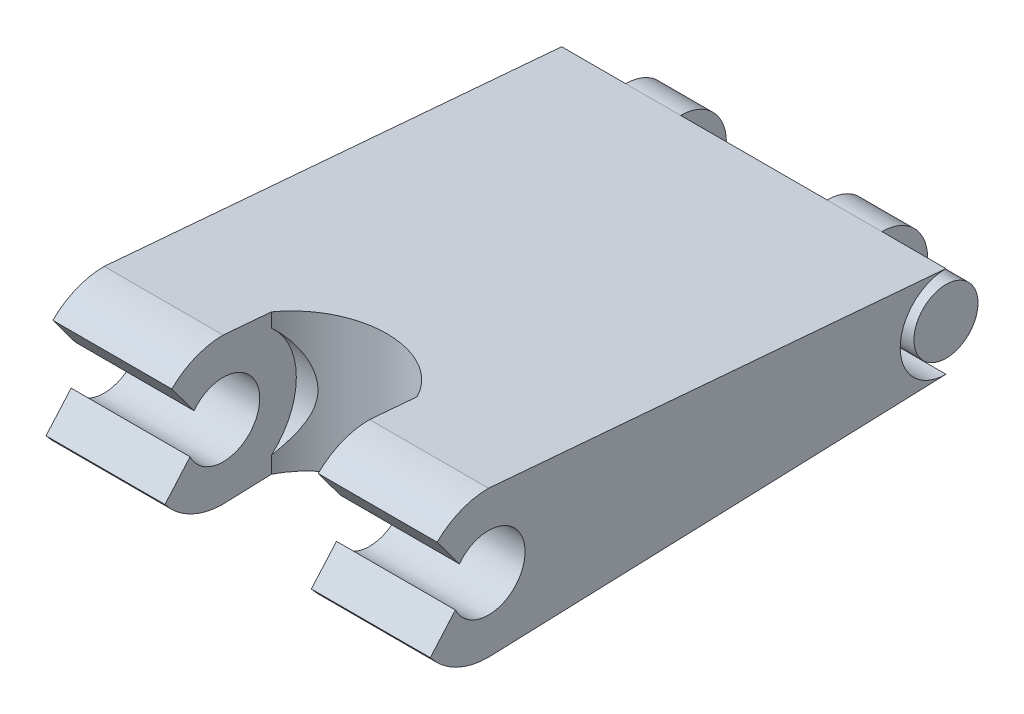
ISO-10303-21;
HEADER;
FILE_DESCRIPTION(('STEP AP214'),'2;1');
FILE_NAME('part.step','',(''),(''),'','','');
FILE_SCHEMA(('AUTOMOTIVE_DESIGN { 1 0 10303 214 1 1 1 1 }'));
ENDSEC;
DATA;
#1=APPLICATION_CONTEXT('core data for automotive mechanical design processes');
#2=APPLICATION_PROTOCOL_DEFINITION('international standard','automotive_design',2000,#1);
#3=PRODUCT_CONTEXT('',#1,'mechanical');
#4=PRODUCT('Part','Part','',(#3));
#5=PRODUCT_RELATED_PRODUCT_CATEGORY('part','',(#4));
#6=PRODUCT_DEFINITION_FORMATION('','',#4);
#7=PRODUCT_DEFINITION_CONTEXT('part definition',#1,'design');
#8=PRODUCT_DEFINITION('design','',#6,#7);
#9=PRODUCT_DEFINITION_SHAPE('','',#8);
#10=(LENGTH_UNIT() NAMED_UNIT(*) SI_UNIT(.MILLI.,.METRE.));
#11=(NAMED_UNIT(*) PLANE_ANGLE_UNIT() SI_UNIT($,.RADIAN.));
#12=(NAMED_UNIT(*) SI_UNIT($,.STERADIAN.) SOLID_ANGLE_UNIT());
#13=UNCERTAINTY_MEASURE_WITH_UNIT(LENGTH_MEASURE(1.E-05),#10,'distance_accuracy_value','');
#14=(GEOMETRIC_REPRESENTATION_CONTEXT(3) GLOBAL_UNCERTAINTY_ASSIGNED_CONTEXT((#13)) GLOBAL_UNIT_ASSIGNED_CONTEXT((#10,
#11,#12)) REPRESENTATION_CONTEXT('',''));
#15=CARTESIAN_POINT('',(0.,0.,0.));
#16=DIRECTION('',(0.,0.,1.));
#17=DIRECTION('',(1.,0.,0.));
#18=AXIS2_PLACEMENT_3D('',#15,#16,#17);
#19=CARTESIAN_POINT('',(-21.,0.,0.));
#20=DIRECTION('',(1.,0.,0.));
#21=DIRECTION('',(0.,0.,-1.));
#22=AXIS2_PLACEMENT_3D('',#19,#20,#21);
#23=PLANE('',#22);
#24=DIRECTION('',(0.,0.802569105901608,0.596559159054904));
#25=VECTOR('',#24,1.);
#26=CARTESIAN_POINT('',(-21.,5.70069365156147,5.61267243753337));
#27=LINE('',#26,#25);
#28=CARTESIAN_POINT('',(-21.,2.42718176620076,3.17943213071494));
#29=VERTEX_POINT('',#28);
#30=CARTESIAN_POINT('',(-21.,5.70069365156147,5.61267243753337));
#31=VERTEX_POINT('',#30);
#32=EDGE_CURVE('E319',#29,#31,#27,.T.);
#33=ORIENTED_EDGE('',*,*,#32,.T.);
#34=CARTESIAN_POINT('',(-21.,0.,0.));
#35=DIRECTION('',(1.,0.,0.));
#36=DIRECTION('',(0.,0.,-1.));
#37=AXIS2_PLACEMENT_3D('',#34,#35,#36);
#38=CIRCLE('',#37,8.);
#39=CARTESIAN_POINT('',(-21.,8.,0.));
#40=VERTEX_POINT('',#39);
#41=EDGE_CURVE('E238',#40,#31,#38,.T.);
#42=ORIENTED_EDGE('',*,*,#41,.F.);
#43=DIRECTION('',(0.,-0.0838982484988429,-0.996474326763528));
#44=VECTOR('',#43,1.);
#45=CARTESIAN_POINT('',(-21.,7.94368867119061,-0.668819605516189));
#46=LINE('',#45,#44);
#47=CARTESIAN_POINT('',(-21.,3.7902453557766,-50.));
#48=VERTEX_POINT('',#47);
#49=EDGE_CURVE('E233',#40,#48,#46,.T.);
#50=ORIENTED_EDGE('',*,*,#49,.T.);
#51=CARTESIAN_POINT('',(-21.,-1.2097546442234,-50.));
#52=DIRECTION('',(1.,0.,0.));
#53=DIRECTION('',(0.,0.,-1.));
#54=AXIS2_PLACEMENT_3D('',#51,#52,#53);
#55=CIRCLE('',#54,5.);
#56=CARTESIAN_POINT('',(-21.,-6.2097546442234,-50.));
#57=VERTEX_POINT('',#56);
#58=EDGE_CURVE('E438',#48,#57,#55,.T.);
#59=ORIENTED_EDGE('',*,*,#58,.T.);
#60=DIRECTION('',(0.,-0.0357819783679942,0.999359619968744));
#61=VECTOR('',#60,1.);
#62=CARTESIAN_POINT('',(-21.,-7.98975720019258,-0.286072514428548));
#63=LINE('',#62,#61);
#64=CARTESIAN_POINT('',(-21.,-8.,0.));
#65=VERTEX_POINT('',#64);
#66=EDGE_CURVE('E230',#57,#65,#63,.T.);
#67=ORIENTED_EDGE('',*,*,#66,.T.);
#68=CARTESIAN_POINT('',(-21.,-4.85376863620386,6.35931836175889));
#69=VERTEX_POINT('',#68);
#70=EDGE_CURVE('E237',#69,#65,#38,.T.);
#71=ORIENTED_EDGE('',*,*,#70,.F.);
#72=DIRECTION('',(0.,-0.752535857507383,0.65855127603371));
#73=VECTOR('',#72,1.);
#74=CARTESIAN_POINT('',(-21.,-4.85376863620386,6.35931836175889));
#75=LINE('',#74,#73);
#76=CARTESIAN_POINT('',(-21.,-1.71584498495738,3.61329157245808));
#77=VERTEX_POINT('',#76);
#78=EDGE_CURVE('E324',#77,#69,#75,.T.);
#79=ORIENTED_EDGE('',*,*,#78,.F.);
#80=CARTESIAN_POINT('',(-21.,0.,0.));
#81=DIRECTION('',(1.,0.,0.));
#82=DIRECTION('',(0.,0.,-1.));
#83=AXIS2_PLACEMENT_3D('',#80,#81,#82);
#84=CIRCLE('',#83,4.);
#85=EDGE_CURVE('E241',#77,#29,#84,.T.);
#86=ORIENTED_EDGE('',*,*,#85,.T.);
#87=EDGE_LOOP('',(#33,#42,#50,#59,#67,#71,#79,#86));
#88=FACE_BOUND('',#87,.T.);
#89=ADVANCED_FACE('F47',(#88),#23,.F.);
#90=CARTESIAN_POINT('',(21.,0.,0.));
#91=DIRECTION('',(-1.,0.,0.));
#92=DIRECTION('',(0.,0.,1.));
#93=AXIS2_PLACEMENT_3D('',#90,#91,#92);
#94=CYLINDRICAL_SURFACE('',#93,8.);
#95=DIRECTION('',(1.,0.,0.));
#96=VECTOR('',#95,1.);
#97=CARTESIAN_POINT('',(-32.6032128639547,5.70069365156147,5.61267243753337));
#98=LINE('',#97,#96);
#99=CARTESIAN_POINT('',(-8.,5.70069365156147,5.61267243753337));
#100=VERTEX_POINT('',#99);
#101=EDGE_CURVE('E316',#31,#100,#98,.T.);
#102=ORIENTED_EDGE('',*,*,#101,.T.);
#103=CARTESIAN_POINT('',(-8.,0.,0.));
#104=DIRECTION('',(1.,0.,0.));
#105=DIRECTION('',(0.,0.,-1.));
#106=AXIS2_PLACEMENT_3D('',#103,#104,#105);
#107=CIRCLE('',#106,8.);
#108=CARTESIAN_POINT('',(-8.,8.,0.));
#109=VERTEX_POINT('',#108);
#110=EDGE_CURVE('E478',#109,#100,#107,.T.);
#111=ORIENTED_EDGE('',*,*,#110,.F.);
#112=DIRECTION('',(-1.,0.,0.));
#113=VECTOR('',#112,1.);
#114=CARTESIAN_POINT('',(21.,8.,0.));
#115=LINE('',#114,#113);
#116=EDGE_CURVE('E245',#109,#40,#115,.T.);
#117=ORIENTED_EDGE('',*,*,#116,.T.);
#118=ORIENTED_EDGE('',*,*,#41,.T.);
#119=EDGE_LOOP('',(#102,#111,#117,#118));
#120=FACE_BOUND('',#119,.T.);
#121=ADVANCED_FACE('F419',(#120),#94,.T.);
#122=CARTESIAN_POINT('',(21.,0.,0.));
#123=DIRECTION('',(-1.,0.,0.));
#124=DIRECTION('',(0.,0.,1.));
#125=AXIS2_PLACEMENT_3D('',#122,#123,#124);
#126=CYLINDRICAL_SURFACE('',#125,4.);
#127=CARTESIAN_POINT('',(-8.,0.,0.));
#128=DIRECTION('',(1.,0.,0.));
#129=DIRECTION('',(0.,0.,-1.));
#130=AXIS2_PLACEMENT_3D('',#127,#128,#129);
#131=CIRCLE('',#130,4.);
#132=CARTESIAN_POINT('',(-8.,-1.71584498495738,3.61329157245808));
#133=VERTEX_POINT('',#132);
#134=CARTESIAN_POINT('',(-8.,2.42718176620076,3.17943213071494));
#135=VERTEX_POINT('',#134);
#136=EDGE_CURVE('E473',#133,#135,#131,.T.);
#137=ORIENTED_EDGE('',*,*,#136,.T.);
#138=DIRECTION('',(1.,0.,0.));
#139=VECTOR('',#138,1.);
#140=CARTESIAN_POINT('',(-32.6032128639547,2.42718176620076,3.17943213071494));
#141=LINE('',#140,#139);
#142=EDGE_CURVE('E70',#29,#135,#141,.T.);
#143=ORIENTED_EDGE('',*,*,#142,.F.);
#144=ORIENTED_EDGE('',*,*,#85,.F.);
#145=DIRECTION('',(1.,0.,0.));
#146=VECTOR('',#145,1.);
#147=CARTESIAN_POINT('',(-32.6032128639547,-1.71584498495738,3.61329157245808));
#148=LINE('',#147,#146);
#149=EDGE_CURVE('E321',#77,#133,#148,.T.);
#150=ORIENTED_EDGE('',*,*,#149,.T.);
#151=EDGE_LOOP('',(#137,#143,#144,#150));
#152=FACE_BOUND('',#151,.T.);
#153=ADVANCED_FACE('F425',(#152),#126,.F.);
#154=CARTESIAN_POINT('',(8.,5.70069365156147,5.61267243753337));
#155=VERTEX_POINT('',#154);
#156=CARTESIAN_POINT('',(21.,5.70069365156147,5.61267243753337));
#157=VERTEX_POINT('',#156);
#158=EDGE_CURVE('E311',#155,#157,#98,.T.);
#159=ORIENTED_EDGE('',*,*,#158,.T.);
#160=CARTESIAN_POINT('',(21.,0.,0.));
#161=DIRECTION('',(1.,0.,0.));
#162=DIRECTION('',(0.,0.,-1.));
#163=AXIS2_PLACEMENT_3D('',#160,#161,#162);
#164=CIRCLE('',#163,8.);
#165=CARTESIAN_POINT('',(21.,8.,0.));
#166=VERTEX_POINT('',#165);
#167=EDGE_CURVE('E220',#166,#157,#164,.T.);
#168=ORIENTED_EDGE('',*,*,#167,.F.);
#169=CARTESIAN_POINT('',(8.,8.,0.));
#170=VERTEX_POINT('',#169);
#171=EDGE_CURVE('E246',#166,#170,#115,.T.);
#172=ORIENTED_EDGE('',*,*,#171,.T.);
#173=CARTESIAN_POINT('',(8.,0.,0.));
#174=DIRECTION('',(1.,0.,0.));
#175=DIRECTION('',(0.,0.,-1.));
#176=AXIS2_PLACEMENT_3D('',#173,#174,#175);
#177=CIRCLE('',#176,8.);
#178=EDGE_CURVE('E288',#170,#155,#177,.T.);
#179=ORIENTED_EDGE('',*,*,#178,.T.);
#180=EDGE_LOOP('',(#159,#168,#172,#179));
#181=FACE_BOUND('',#180,.T.);
#182=ADVANCED_FACE('F310',(#181),#94,.T.);
#183=CARTESIAN_POINT('',(21.,0.,0.));
#184=DIRECTION('',(1.,0.,0.));
#185=DIRECTION('',(0.,0.,-1.));
#186=AXIS2_PLACEMENT_3D('',#183,#184,#185);
#187=CIRCLE('',#186,4.);
#188=CARTESIAN_POINT('',(21.,-1.71584498495738,3.61329157245808));
#189=VERTEX_POINT('',#188);
#190=CARTESIAN_POINT('',(21.,2.42718176620076,3.17943213071494));
#191=VERTEX_POINT('',#190);
#192=EDGE_CURVE('E214',#189,#191,#187,.T.);
#193=ORIENTED_EDGE('',*,*,#192,.T.);
#194=CARTESIAN_POINT('',(8.,2.42718176620076,3.17943213071494));
#195=VERTEX_POINT('',#194);
#196=EDGE_CURVE('E276',#195,#191,#141,.T.);
#197=ORIENTED_EDGE('',*,*,#196,.F.);
#198=CARTESIAN_POINT('',(8.,0.,0.));
#199=DIRECTION('',(1.,0.,0.));
#200=DIRECTION('',(0.,0.,-1.));
#201=AXIS2_PLACEMENT_3D('',#198,#199,#200);
#202=CIRCLE('',#201,4.);
#203=CARTESIAN_POINT('',(8.,-1.71584498495738,3.61329157245808));
#204=VERTEX_POINT('',#203);
#205=EDGE_CURVE('E269',#204,#195,#202,.T.);
#206=ORIENTED_EDGE('',*,*,#205,.F.);
#207=EDGE_CURVE('E275',#204,#189,#148,.T.);
#208=ORIENTED_EDGE('',*,*,#207,.T.);
#209=EDGE_LOOP('',(#193,#197,#206,#208));
#210=FACE_BOUND('',#209,.T.);
#211=ADVANCED_FACE('F274',(#210),#126,.F.);
#212=CARTESIAN_POINT('',(21.,0.,0.));
#213=DIRECTION('',(1.,0.,0.));
#214=DIRECTION('',(0.,0.,-1.));
#215=AXIS2_PLACEMENT_3D('',#212,#213,#214);
#216=PLANE('',#215);
#217=ORIENTED_EDGE('',*,*,#167,.T.);
#218=DIRECTION('',(0.,-0.802569105901608,-0.596559159054904));
#219=VECTOR('',#218,1.);
#220=CARTESIAN_POINT('',(21.,5.70069365156147,5.61267243753337));
#221=LINE('',#220,#219);
#222=EDGE_CURVE('E203',#157,#191,#221,.T.);
#223=ORIENTED_EDGE('',*,*,#222,.T.);
#224=ORIENTED_EDGE('',*,*,#192,.F.);
#225=DIRECTION('',(0.,0.752535857507383,-0.65855127603371));
#226=VECTOR('',#225,1.);
#227=CARTESIAN_POINT('',(21.,-4.85376863620386,6.35931836175889));
#228=LINE('',#227,#226);
#229=CARTESIAN_POINT('',(21.,-4.85376863620386,6.35931836175889));
#230=VERTEX_POINT('',#229);
#231=EDGE_CURVE('E197',#230,#189,#228,.T.);
#232=ORIENTED_EDGE('',*,*,#231,.F.);
#233=CARTESIAN_POINT('',(21.,-8.,0.));
#234=VERTEX_POINT('',#233);
#235=EDGE_CURVE('E210',#230,#234,#164,.T.);
#236=ORIENTED_EDGE('',*,*,#235,.T.);
#237=DIRECTION('',(0.,-0.0357819783679942,0.999359619968744));
#238=VECTOR('',#237,1.);
#239=CARTESIAN_POINT('',(21.,-7.98975720019258,-0.286072514428548));
#240=LINE('',#239,#238);
#241=CARTESIAN_POINT('',(21.,-6.2097546442234,-50.0000000000001));
#242=VERTEX_POINT('',#241);
#243=EDGE_CURVE('E224',#242,#234,#240,.T.);
#244=ORIENTED_EDGE('',*,*,#243,.F.);
#245=CARTESIAN_POINT('',(21.,-1.2097546442234,-50.));
#246=DIRECTION('',(1.,0.,0.));
#247=DIRECTION('',(0.,0.,-1.));
#248=AXIS2_PLACEMENT_3D('',#245,#246,#247);
#249=CIRCLE('',#248,5.);
#250=CARTESIAN_POINT('',(21.,3.7902453557766,-50.));
#251=VERTEX_POINT('',#250);
#252=EDGE_CURVE('E298',#251,#242,#249,.T.);
#253=ORIENTED_EDGE('',*,*,#252,.F.);
#254=DIRECTION('',(0.,-0.0838982484988429,-0.996474326763528));
#255=VECTOR('',#254,1.);
#256=CARTESIAN_POINT('',(21.,7.94368867119061,-0.668819605516189));
#257=LINE('',#256,#255);
#258=EDGE_CURVE('E221',#166,#251,#257,.T.);
#259=ORIENTED_EDGE('',*,*,#258,.F.);
#260=EDGE_LOOP('',(#217,#223,#224,#232,#236,#244,#253,#259));
#261=FACE_BOUND('',#260,.T.);
#262=ADVANCED_FACE('F208',(#261),#216,.T.);
#263=CARTESIAN_POINT('',(-8.,0.,0.));
#264=DIRECTION('',(1.,0.,0.));
#265=DIRECTION('',(0.,0.,-1.));
#266=AXIS2_PLACEMENT_3D('',#263,#264,#265);
#267=PLANE('',#266);
#268=ORIENTED_EDGE('',*,*,#110,.T.);
#269=DIRECTION('',(0.,-0.802569105901608,-0.596559159054904));
#270=VECTOR('',#269,1.);
#271=CARTESIAN_POINT('',(-8.,-0.658456042941642,0.885840858593788));
#272=LINE('',#271,#270);
#273=EDGE_CURVE('E328',#100,#135,#272,.T.);
#274=ORIENTED_EDGE('',*,*,#273,.T.);
#275=ORIENTED_EDGE('',*,*,#136,.F.);
#276=DIRECTION('',(0.,0.752535857507383,-0.65855127603371));
#277=VECTOR('',#276,1.);
#278=CARTESIAN_POINT('',(-8.,1.04654306105377,1.19589955790806));
#279=LINE('',#278,#277);
#280=CARTESIAN_POINT('',(-8.,-4.85376863620386,6.35931836175889));
#281=VERTEX_POINT('',#280);
#282=EDGE_CURVE('E326',#281,#133,#279,.T.);
#283=ORIENTED_EDGE('',*,*,#282,.F.);
#284=CARTESIAN_POINT('',(-8.,-8.,0.));
#285=VERTEX_POINT('',#284);
#286=EDGE_CURVE('E477',#281,#285,#107,.T.);
#287=ORIENTED_EDGE('',*,*,#286,.T.);
#288=DIRECTION('',(0.,-0.0357819783679942,0.999359619968744));
#289=VECTOR('',#288,1.);
#290=CARTESIAN_POINT('',(-8.,-7.98975720019258,-0.286072514428548));
#291=LINE('',#290,#289);
#292=CARTESIAN_POINT('',(-8.,-7.81122895886329,-5.27221144653723));
#293=VERTEX_POINT('',#292);
#294=EDGE_CURVE('E285',#293,#285,#291,.T.);
#295=ORIENTED_EDGE('',*,*,#294,.F.);
#296=DIRECTION('',(0.,1.,0.));
#297=VECTOR('',#296,1.);
#298=CARTESIAN_POINT('',(-8.,-10.,-5.27221144653723));
#299=LINE('',#298,#297);
#300=CARTESIAN_POINT('',(-8.,-6.01695824009123,-5.27221144653723));
#301=VERTEX_POINT('',#300);
#302=EDGE_CURVE('E335',#293,#301,#299,.T.);
#303=ORIENTED_EDGE('',*,*,#302,.T.);
#304=CARTESIAN_POINT('',(-8.,6.01695824009123,-5.27221144653723));
#305=VERTEX_POINT('',#304);
#306=EDGE_CURVE('E234',#301,#305,#107,.T.);
#307=ORIENTED_EDGE('',*,*,#306,.T.);
#308=CARTESIAN_POINT('',(-8.,7.55610566755224,-5.27221144653723));
#309=VERTEX_POINT('',#308);
#310=EDGE_CURVE('E330',#305,#309,#299,.T.);
#311=ORIENTED_EDGE('',*,*,#310,.T.);
#312=DIRECTION('',(0.,-0.0838982484988429,-0.996474326763528));
#313=VECTOR('',#312,1.);
#314=CARTESIAN_POINT('',(-8.,7.94368867119061,-0.668819605516189));
#315=LINE('',#314,#313);
#316=EDGE_CURVE('E476',#109,#309,#315,.T.);
#317=ORIENTED_EDGE('',*,*,#316,.F.);
#318=EDGE_LOOP('',(#268,#274,#275,#283,#287,#295,#303,#307,#311,#317));
#319=FACE_BOUND('',#318,.T.);
#320=ADVANCED_FACE('F407',(#319),#267,.T.);
#321=CARTESIAN_POINT('',(8.,0.,0.));
#322=DIRECTION('',(1.,0.,0.));
#323=DIRECTION('',(0.,0.,-1.));
#324=AXIS2_PLACEMENT_3D('',#321,#322,#323);
#325=PLANE('',#324);
#326=DIRECTION('',(0.,-0.802569105901608,-0.596559159054904));
#327=VECTOR('',#326,1.);
#328=CARTESIAN_POINT('',(8.,-0.658456042941642,0.885840858593788));
#329=LINE('',#328,#327);
#330=EDGE_CURVE('E11',#155,#195,#329,.T.);
#331=ORIENTED_EDGE('',*,*,#330,.F.);
#332=ORIENTED_EDGE('',*,*,#178,.F.);
#333=DIRECTION('',(0.,-0.0838982484988429,-0.996474326763528));
#334=VECTOR('',#333,1.);
#335=CARTESIAN_POINT('',(8.,7.94368867119061,-0.668819605516189));
#336=LINE('',#335,#334);
#337=CARTESIAN_POINT('',(8.,7.56150363340333,-5.20809885201226));
#338=VERTEX_POINT('',#337);
#339=EDGE_CURVE('E277',#170,#338,#336,.T.);
#340=ORIENTED_EDGE('',*,*,#339,.T.);
#341=DIRECTION('',(0.,1.,0.));
#342=VECTOR('',#341,1.);
#343=CARTESIAN_POINT('',(8.,-10.,-5.20809885201226));
#344=LINE('',#343,#342);
#345=CARTESIAN_POINT('',(8.,6.07253706021368,-5.20809885201226));
#346=VERTEX_POINT('',#345);
#347=EDGE_CURVE('E331',#346,#338,#344,.T.);
#348=ORIENTED_EDGE('',*,*,#347,.F.);
#349=CARTESIAN_POINT('',(8.,-6.07253706021368,-5.20809885201226));
#350=VERTEX_POINT('',#349);
#351=EDGE_CURVE('E292',#350,#346,#177,.T.);
#352=ORIENTED_EDGE('',*,*,#351,.F.);
#353=CARTESIAN_POINT('',(8.,-7.81352450435519,-5.20809885201226));
#354=VERTEX_POINT('',#353);
#355=EDGE_CURVE('E334',#354,#350,#344,.T.);
#356=ORIENTED_EDGE('',*,*,#355,.F.);
#357=DIRECTION('',(0.,-0.0357819783679942,0.999359619968744));
#358=VECTOR('',#357,1.);
#359=CARTESIAN_POINT('',(8.,-7.98975720019258,-0.286072514428548));
#360=LINE('',#359,#358);
#361=CARTESIAN_POINT('',(8.,-8.,0.));
#362=VERTEX_POINT('',#361);
#363=EDGE_CURVE('E291',#354,#362,#360,.T.);
#364=ORIENTED_EDGE('',*,*,#363,.T.);
#365=CARTESIAN_POINT('',(8.,-4.85376863620386,6.35931836175889));
#366=VERTEX_POINT('',#365);
#367=EDGE_CURVE('E271',#366,#362,#177,.T.);
#368=ORIENTED_EDGE('',*,*,#367,.F.);
#369=DIRECTION('',(0.,0.752535857507383,-0.65855127603371));
#370=VECTOR('',#369,1.);
#371=CARTESIAN_POINT('',(8.,1.04654306105377,1.19589955790806));
#372=LINE('',#371,#370);
#373=EDGE_CURVE('E55',#366,#204,#372,.T.);
#374=ORIENTED_EDGE('',*,*,#373,.T.);
#375=ORIENTED_EDGE('',*,*,#205,.T.);
#376=EDGE_LOOP('',(#331,#332,#340,#348,#352,#356,#364,#368,#374,#375));
#377=FACE_BOUND('',#376,.T.);
#378=ADVANCED_FACE('F268',(#377),#325,.F.);
#379=CARTESIAN_POINT('',(-8.,0.,0.));
#380=DIRECTION('',(1.,0.,0.));
#381=DIRECTION('',(0.,0.,-1.));
#382=AXIS2_PLACEMENT_3D('',#379,#380,#381);
#383=CYLINDRICAL_SURFACE('',#382,8.);
#384=ORIENTED_EDGE('',*,*,#306,.F.);
#385=CARTESIAN_POINT('',(-8.,-6.01695824009123,-5.27221144653723));
#386=CARTESIAN_POINT('',(-7.94823025137552,-5.93713889680411,-5.36330149977239));
#387=CARTESIAN_POINT('',(-7.89559362321301,-5.85551549790246,-5.45228635927292));
#388=CARTESIAN_POINT('',(-7.78892781803338,-5.68878236547478,-5.62603421921067));
#389=CARTESIAN_POINT('',(-7.73489880225821,-5.60367303496163,-5.71079770518938));
#390=CARTESIAN_POINT('',(-7.57121137553407,-5.3432621947039,-5.95877760265931));
#391=CARTESIAN_POINT('',(-7.45995761571154,-5.16288551480237,-6.11567471521768));
#392=CARTESIAN_POINT('',(-7.23495802940669,-4.78734423112402,-6.41400745377933));
#393=CARTESIAN_POINT('',(-7.12119825552961,-4.5920395394191,-6.55525533401989));
#394=CARTESIAN_POINT('',(-6.89574152907166,-4.18869608537276,-6.82004585449234));
#395=CARTESIAN_POINT('',(-6.78404404978122,-3.98066063470516,-6.94359307152216));
#396=CARTESIAN_POINT('',(-6.59555848325829,-3.60869152760248,-7.14207092545249));
#397=CARTESIAN_POINT('',(-6.51737373601737,-3.44770842075212,-7.22120164271144));
#398=CARTESIAN_POINT('',(-6.36620732476054,-3.11878938302571,-7.36924408818434));
#399=CARTESIAN_POINT('',(-6.29322674091125,-2.95085202010472,-7.4381536981111));
#400=CARTESIAN_POINT('',(-6.08593171119349,-2.43759597245042,-7.6282717607243));
#401=CARTESIAN_POINT('',(-5.96243998615266,-2.08129312089943,-7.73370260976427));
#402=CARTESIAN_POINT('',(-5.82814154731233,-1.57531287188291,-7.84463777316662));
#403=CARTESIAN_POINT('',(-5.7951759477782,-1.43584869912706,-7.87138908437504));
#404=CARTESIAN_POINT('',(-5.7376135669897,-1.15403731401675,-7.91760994896661));
#405=CARTESIAN_POINT('',(-5.71301240068372,-1.01169165388259,-7.93708331834156));
#406=CARTESIAN_POINT('',(-5.67321561809807,-0.725052948608439,-7.96837858060076));
#407=CARTESIAN_POINT('',(-5.65800698660538,-0.580762882607102,-7.98021106248723));
#408=CARTESIAN_POINT('',(-5.63764174464046,-0.291034278903472,-7.99602033635428));
#409=CARTESIAN_POINT('',(-5.63248509140908,-0.145595746089176,-7.99999716175128));
#410=CARTESIAN_POINT('',(-5.6324777652854,0.145582975283477,-8.00000284104297));
#411=CARTESIAN_POINT('',(-5.63764843537934,0.291323165442788,-7.99601523522773));
#412=CARTESIAN_POINT('',(-5.65808293099716,0.581648746690105,-7.98015201605002));
#413=CARTESIAN_POINT('',(-5.67334681495315,0.726234131087749,-7.96827635702165));
#414=CARTESIAN_POINT('',(-5.71329081562983,1.01345787665312,-7.93686343339263));
#415=CARTESIAN_POINT('',(-5.73798437467414,1.15609315581843,-7.91731523020636));
#416=CARTESIAN_POINT('',(-5.79576108313442,1.43846849324314,-7.87091614278629));
#417=CARTESIAN_POINT('',(-5.8288487286525,1.57820695636161,-7.84406134437998));
#418=CARTESIAN_POINT('',(-5.96740405655398,2.09934837015178,-7.72958060076222));
#419=CARTESIAN_POINT('',(-6.09712052810554,2.46956073678866,-7.61867917900986));
#420=CARTESIAN_POINT('',(-6.31487822187905,3.00188212510032,-7.41789040336493));
#421=CARTESIAN_POINT('',(-6.3915607000634,3.17591735996042,-7.34498358960105));
#422=CARTESIAN_POINT('',(-6.55027915641499,3.51645960307151,-7.18815408377895));
#423=CARTESIAN_POINT('',(-6.63231374168484,3.68296855110949,-7.10423425217707));
#424=CARTESIAN_POINT('',(-6.82196447001901,4.05199354099719,-6.90193758906819));
#425=CARTESIAN_POINT('',(-6.93055790862777,4.25223924174451,-6.78034603919861));
#426=CARTESIAN_POINT('',(-7.14936966613671,4.64075980368504,-6.52057753656378));
#427=CARTESIAN_POINT('',(-7.25958825759255,4.82903262810923,-6.3823977733745));
#428=CARTESIAN_POINT('',(-7.47738579616235,5.19127838688786,-6.09130949826248));
#429=CARTESIAN_POINT('',(-7.58498047351415,5.36538740607265,-5.93858247468503));
#430=CARTESIAN_POINT('',(-7.79615362741304,5.70088439540956,-5.61726576134988));
#431=CARTESIAN_POINT('',(-7.89973250938678,5.86227365143152,-5.44867767881245));
#432=CARTESIAN_POINT('',(-8.00000000000003,6.01695824009122,-5.27221144653724));
#433=B_SPLINE_CURVE_WITH_KNOTS('',3,(#385,#386,#387,#388,#389,#390,#391,#392,#393,#394,#395,
#396,#397,#398,#399,#400,#401,#402,#403,#404,#405,#406,#407,#408,#409,#410,#411,#412,#413,#414,
#415,#416,#417,#418,#419,#420,#421,#422,#423,#424,#425,#426,#427,#428,#429,#430,#431,#432),
.UNSPECIFIED.,.F.,.F.,(4,2,2,2,2,2,2,2,2,2,2,2,2,2,2,2,2,2,2,2,2,2,2,4),(0.,0.395070827970136,
0.790096109528034,1.5801845715534,2.37890903575441,3.17742660242258,3.76399666607666,
4.35068812488924,5.5183097425892,5.95532108522114,6.39210297025337,6.82827824161023,
7.26445165755846,7.70152742501366,8.13860572283069,8.57630943078743,9.01424808163703,
10.2293238916775,10.8400866283132,11.4506910418506,12.2244880247928,12.9984162922138,
13.7637116118872,14.5289294666133),.UNSPECIFIED.);
#434=EDGE_CURVE('E347',#301,#305,#433,.T.);
#435=ORIENTED_EDGE('',*,*,#434,.T.);
#436=EDGE_LOOP('',(#384,#435));
#437=FACE_BOUND('',#436,.T.);
#438=ADVANCED_FACE('F411',(#437),#383,.F.);
#439=CARTESIAN_POINT('',(21.,-1.2097546442234,-50.));
#440=DIRECTION('',(-1.,0.,0.));
#441=DIRECTION('',(0.,0.,1.));
#442=AXIS2_PLACEMENT_3D('',#439,#440,#441);
#443=CYLINDRICAL_SURFACE('',#442,5.);
#444=CARTESIAN_POINT('',(-14.,-1.2097546442234,-50.));
#445=DIRECTION('',(1.,0.,0.));
#446=DIRECTION('',(0.,0.,-1.));
#447=AXIS2_PLACEMENT_3D('',#444,#445,#446);
#448=CIRCLE('',#447,5.);
#449=CARTESIAN_POINT('',(-14.,-6.2097546442234,-50.0000000000001));
#450=VERTEX_POINT('',#449);
#451=CARTESIAN_POINT('',(-14.,3.7902453557766,-50.));
#452=VERTEX_POINT('',#451);
#453=EDGE_CURVE('E489',#450,#452,#448,.T.);
#454=ORIENTED_EDGE('',*,*,#453,.T.);
#455=DIRECTION('',(-1.,0.,0.));
#456=VECTOR('',#455,1.);
#457=CARTESIAN_POINT('',(21.,3.7902453557766,-50.));
#458=LINE('',#457,#456);
#459=CARTESIAN_POINT('',(-8.,3.7902453557766,-50.));
#460=VERTEX_POINT('',#459);
#461=EDGE_CURVE('E249',#460,#452,#458,.T.);
#462=ORIENTED_EDGE('',*,*,#461,.F.);
#463=CARTESIAN_POINT('',(-8.,-1.2097546442234,-50.));
#464=DIRECTION('',(1.,0.,0.));
#465=DIRECTION('',(0.,0.,-1.));
#466=AXIS2_PLACEMENT_3D('',#463,#464,#465);
#467=CIRCLE('',#466,5.);
#468=CARTESIAN_POINT('',(-8.,-6.2097546442234,-50.));
#469=VERTEX_POINT('',#468);
#470=EDGE_CURVE('E263',#469,#460,#467,.T.);
#471=ORIENTED_EDGE('',*,*,#470,.F.);
#472=DIRECTION('',(-1.,0.,0.));
#473=VECTOR('',#472,1.);
#474=CARTESIAN_POINT('',(21.,-6.2097546442234,-50.));
#475=LINE('',#474,#473);
#476=EDGE_CURVE('E253',#469,#450,#475,.T.);
#477=ORIENTED_EDGE('',*,*,#476,.T.);
#478=EDGE_LOOP('',(#454,#462,#471,#477));
#479=FACE_BOUND('',#478,.T.);
#480=ADVANCED_FACE('F416',(#479),#443,.T.);
#481=CARTESIAN_POINT('',(14.,-1.2097546442234,-50.));
#482=DIRECTION('',(1.,0.,0.));
#483=DIRECTION('',(0.,0.,-1.));
#484=AXIS2_PLACEMENT_3D('',#481,#482,#483);
#485=CIRCLE('',#484,5.);
#486=CARTESIAN_POINT('',(14.,-6.2097546442234,-50.));
#487=VERTEX_POINT('',#486);
#488=CARTESIAN_POINT('',(14.,3.7902453557766,-50.));
#489=VERTEX_POINT('',#488);
#490=EDGE_CURVE('E459',#487,#489,#485,.T.);
#491=ORIENTED_EDGE('',*,*,#490,.F.);
#492=CARTESIAN_POINT('',(8.,-6.2097546442234,-50.));
#493=VERTEX_POINT('',#492);
#494=EDGE_CURVE('E259',#487,#493,#475,.T.);
#495=ORIENTED_EDGE('',*,*,#494,.T.);
#496=CARTESIAN_POINT('',(8.,-1.2097546442234,-50.));
#497=DIRECTION('',(1.,0.,0.));
#498=DIRECTION('',(0.,0.,-1.));
#499=AXIS2_PLACEMENT_3D('',#496,#497,#498);
#500=CIRCLE('',#499,5.);
#501=CARTESIAN_POINT('',(8.,3.7902453557766,-50.));
#502=VERTEX_POINT('',#501);
#503=EDGE_CURVE('E258',#493,#502,#500,.T.);
#504=ORIENTED_EDGE('',*,*,#503,.T.);
#505=EDGE_CURVE('E254',#489,#502,#458,.T.);
#506=ORIENTED_EDGE('',*,*,#505,.F.);
#507=EDGE_LOOP('',(#491,#495,#504,#506));
#508=FACE_BOUND('',#507,.T.);
#509=ADVANCED_FACE('F507',(#508),#443,.T.);
#510=CARTESIAN_POINT('',(21.,-7.98975720019258,-0.286072514428548));
#511=DIRECTION('',(0.,-0.999359619968744,-0.0357819783679942));
#512=DIRECTION('',(0.,0.0357819783679942,-0.999359619968744));
#513=AXIS2_PLACEMENT_3D('',#510,#511,#512);
#514=PLANE('',#513);
#515=ORIENTED_EDGE('',*,*,#363,.F.);
#516=CARTESIAN_POINT('',(-0.0180492039932762,-7.97365551367114,-0.735778653016795));
#517=DIRECTION('',(0.,-0.999359619968744,-0.0357819783679942));
#518=DIRECTION('',(0.,0.0357819783679942,-0.999359619968744));
#519=AXIS2_PLACEMENT_3D('',#516,#517,#518);
#520=ELLIPSE('',#519,9.18688309648447,9.181);
#521=EDGE_CURVE('E439',#293,#354,#520,.T.);
#522=ORIENTED_EDGE('',*,*,#521,.F.);
#523=ORIENTED_EDGE('',*,*,#294,.T.);
#524=DIRECTION('',(-1.,0.,0.));
#525=VECTOR('',#524,1.);
#526=CARTESIAN_POINT('',(21.,-8.,0.));
#527=LINE('',#526,#525);
#528=EDGE_CURVE('E229',#285,#65,#527,.T.);
#529=ORIENTED_EDGE('',*,*,#528,.T.);
#530=ORIENTED_EDGE('',*,*,#66,.F.);
#531=DIRECTION('',(-1.,0.,0.));
#532=VECTOR('',#531,1.);
#533=CARTESIAN_POINT('',(-14.,-6.2097546442234,-50.0000000000001));
#534=LINE('',#533,#532);
#535=EDGE_CURVE('E454',#57,#450,#534,.F.);
#536=ORIENTED_EDGE('',*,*,#535,.T.);
#537=ORIENTED_EDGE('',*,*,#476,.F.);
#538=EDGE_CURVE('E260',#493,#469,#475,.T.);
#539=ORIENTED_EDGE('',*,*,#538,.F.);
#540=ORIENTED_EDGE('',*,*,#494,.F.);
#541=EDGE_CURVE('E256',#242,#487,#475,.T.);
#542=ORIENTED_EDGE('',*,*,#541,.F.);
#543=ORIENTED_EDGE('',*,*,#243,.T.);
#544=EDGE_CURVE('E218',#234,#362,#527,.T.);
#545=ORIENTED_EDGE('',*,*,#544,.T.);
#546=EDGE_LOOP('',(#515,#522,#523,#529,#530,#536,#537,#539,#540,#542,#543,#545));
#547=FACE_BOUND('',#546,.T.);
#548=ADVANCED_FACE('F49',(#547),#514,.T.);
#549=CARTESIAN_POINT('',(21.,7.94368867119061,-0.668819605516189));
#550=DIRECTION('',(0.,0.996474326763528,-0.0838982484988429));
#551=DIRECTION('',(0.,0.0838982484988429,0.996474326763528));
#552=AXIS2_PLACEMENT_3D('',#549,#550,#551);
#553=PLANE('',#552);
#554=CARTESIAN_POINT('',(-0.0180492039932762,7.93805104796684,-0.735778653016795));
#555=DIRECTION('',(0.,0.996474326763528,-0.0838982484988429));
#556=DIRECTION('',(0.,0.0838982484988429,0.996474326763528));
#557=AXIS2_PLACEMENT_3D('',#554,#555,#556);
#558=ELLIPSE('',#557,9.21348373301215,9.181);
#559=EDGE_CURVE('E445',#338,#309,#558,.T.);
#560=ORIENTED_EDGE('',*,*,#559,.F.);
#561=ORIENTED_EDGE('',*,*,#339,.F.);
#562=ORIENTED_EDGE('',*,*,#171,.F.);
#563=ORIENTED_EDGE('',*,*,#258,.T.);
#564=EDGE_CURVE('E250',#251,#489,#458,.T.);
#565=ORIENTED_EDGE('',*,*,#564,.T.);
#566=ORIENTED_EDGE('',*,*,#505,.T.);
#567=EDGE_CURVE('E255',#502,#460,#458,.T.);
#568=ORIENTED_EDGE('',*,*,#567,.T.);
#569=ORIENTED_EDGE('',*,*,#461,.T.);
#570=DIRECTION('',(-1.,0.,0.));
#571=VECTOR('',#570,1.);
#572=CARTESIAN_POINT('',(-14.,3.7902453557766,-50.));
#573=LINE('',#572,#571);
#574=EDGE_CURVE('E451',#452,#48,#573,.T.);
#575=ORIENTED_EDGE('',*,*,#574,.T.);
#576=ORIENTED_EDGE('',*,*,#49,.F.);
#577=ORIENTED_EDGE('',*,*,#116,.F.);
#578=ORIENTED_EDGE('',*,*,#316,.T.);
#579=EDGE_LOOP('',(#560,#561,#562,#563,#565,#566,#568,#569,#575,#576,#577,#578));
#580=FACE_BOUND('',#579,.T.);
#581=ADVANCED_FACE('F305',(#580),#553,.T.);
#582=ORIENTED_EDGE('',*,*,#286,.F.);
#583=DIRECTION('',(1.,0.,0.));
#584=VECTOR('',#583,1.);
#585=CARTESIAN_POINT('',(-32.6032128639547,-4.85376863620386,6.35931836175889));
#586=LINE('',#585,#584);
#587=EDGE_CURVE('E62',#69,#281,#586,.T.);
#588=ORIENTED_EDGE('',*,*,#587,.F.);
#589=ORIENTED_EDGE('',*,*,#70,.T.);
#590=ORIENTED_EDGE('',*,*,#528,.F.);
#591=EDGE_LOOP('',(#582,#588,#589,#590));
#592=FACE_BOUND('',#591,.T.);
#593=ADVANCED_FACE('F526',(#592),#94,.T.);
#594=ORIENTED_EDGE('',*,*,#235,.F.);
#595=EDGE_CURVE('E194',#366,#230,#586,.T.);
#596=ORIENTED_EDGE('',*,*,#595,.F.);
#597=ORIENTED_EDGE('',*,*,#367,.T.);
#598=ORIENTED_EDGE('',*,*,#544,.F.);
#599=EDGE_LOOP('',(#594,#596,#597,#598));
#600=FACE_BOUND('',#599,.T.);
#601=ADVANCED_FACE('F216',(#600),#94,.T.);
#602=ORIENTED_EDGE('',*,*,#351,.T.);
#603=CARTESIAN_POINT('',(8.,6.07253706021368,-5.20809885201225));
#604=CARTESIAN_POINT('',(7.94853465950026,5.99339983873956,-5.30036678004099));
#605=CARTESIAN_POINT('',(7.8961583397788,5.91243119421688,-5.39052361840139));
#606=CARTESIAN_POINT('',(7.78992657407529,5.74696031823185,-5.56660144054245));
#607=CARTESIAN_POINT('',(7.73607131176348,5.6624585248771,-5.65252294663889));
#608=CARTESIAN_POINT('',(7.57278717705242,5.40382581562604,-5.90393903154603));
#609=CARTESIAN_POINT('',(7.46163475489094,5.22455965094126,-6.06309438334717));
#610=CARTESIAN_POINT('',(7.23653784358646,4.85122207175219,-6.36584883119283));
#611=CARTESIAN_POINT('',(7.12257629106906,4.65701493664774,-6.50926698905252));
#612=CARTESIAN_POINT('',(6.89632518392295,4.2558064315683,-6.77838198486692));
#613=CARTESIAN_POINT('',(6.78403526414187,4.04880790819051,-6.90408274537037));
#614=CARTESIAN_POINT('',(6.59301911462895,3.67645324832976,-7.10749200666247));
#615=CARTESIAN_POINT('',(6.51304300741896,3.51395782161046,-7.18925993451246));
#616=CARTESIAN_POINT('',(6.35817827888271,3.18180493243304,-7.34231813454473));
#617=CARTESIAN_POINT('',(6.28329078266195,3.01214589944053,-7.41360609360557));
#618=CARTESIAN_POINT('',(6.07017736740224,2.49336478830602,-7.61046892573219));
#619=CARTESIAN_POINT('',(5.94267428868715,2.13291356546753,-7.71988717752235));
#620=CARTESIAN_POINT('',(5.80372720331041,1.62219409011824,-7.83508152180959));
#621=CARTESIAN_POINT('',(5.76978420407213,1.48264065780695,-7.8627146675684));
#622=CARTESIAN_POINT('',(5.71019704436505,1.20056226725205,-7.91069403497842));
#623=CARTESIAN_POINT('',(5.6845485098746,1.05803891752015,-7.9310440979129));
#624=CARTESIAN_POINT('',(5.64262354108391,0.770948741925158,-7.96407478120633));
#625=CARTESIAN_POINT('',(5.62633329276191,0.626385252455711,-7.97676670735137));
#626=CARTESIAN_POINT('',(5.60381442562818,0.33598861908405,-7.99426445946994));
#627=CARTESIAN_POINT('',(5.59758573847572,0.190155483812365,-7.99907033900753));
#628=CARTESIAN_POINT('',(5.59549448476404,-0.102004151310491,-8.00068683047169));
#629=CARTESIAN_POINT('',(5.59965850794195,-0.248330958159014,-7.99747693403331));
#630=CARTESIAN_POINT('',(5.61820113193545,-0.53993119580099,-7.98309385604645));
#631=CARTESIAN_POINT('',(5.632579769044,-0.685204622849888,-7.97192064620399));
#632=CARTESIAN_POINT('',(5.67090135065714,-0.973863052015426,-7.94183109565743));
#633=CARTESIAN_POINT('',(5.69485757513897,-1.11724514532026,-7.92290400276247));
#634=CARTESIAN_POINT('',(5.75132849628436,-1.40117662705247,-7.87765142400628));
#635=CARTESIAN_POINT('',(5.78384781754433,-1.54172444050496,-7.8513219398791));
#636=CARTESIAN_POINT('',(5.86972023685062,-1.8710126830467,-7.7805688210069));
#637=CARTESIAN_POINT('',(5.9263241698083,-2.0582450387767,-7.73305737585086));
#638=CARTESIAN_POINT('',(6.05027529160604,-2.42554356943756,-7.62583710791974));
#639=CARTESIAN_POINT('',(6.11762846014624,-2.60560568555511,-7.56612149085872));
#640=CARTESIAN_POINT('',(6.26049729063122,-2.95903921656603,-7.43503605586805));
#641=CARTESIAN_POINT('',(6.3360463813957,-3.13237899256897,-7.3636178525928));
#642=CARTESIAN_POINT('',(6.49256773937792,-3.47153174687748,-7.20993226219405));
#643=CARTESIAN_POINT('',(6.57353871981751,-3.63734649553628,-7.12766744483988));
#644=CARTESIAN_POINT('',(6.76695941656482,-4.01677877202659,-6.92289494023261));
#645=CARTESIAN_POINT('',(6.8807488554092,-4.22747334213397,-6.79621635588337));
#646=CARTESIAN_POINT('',(7.11019524621669,-4.63568899074487,-6.52460769763769));
#647=CARTESIAN_POINT('',(7.22585263047315,-4.83320696395103,-6.37967334452743));
#648=CARTESIAN_POINT('',(7.4542025540197,-5.21250033354757,-6.07359023953739));
#649=CARTESIAN_POINT('',(7.56691396586246,-5.39443359705198,-5.91265230267686));
#650=CARTESIAN_POINT('',(7.7324706035699,-5.6567971174812,-5.65822267556003));
#651=CARTESIAN_POINT('',(7.78707172587048,-5.74249656086819,-5.57124118492045));
#652=CARTESIAN_POINT('',(7.89476046979507,-5.91027004327429,-5.3929291196214));
#653=CARTESIAN_POINT('',(7.94784789660742,-5.99234361638628,-5.30159798916894));
#654=CARTESIAN_POINT('',(8.00000000000007,-6.07253706021366,-5.20809885201229));
#655=B_SPLINE_CURVE_WITH_KNOTS('',3,(#603,#604,#605,#606,#607,#608,#609,#610,#611,#612,#613,
#614,#615,#616,#617,#618,#619,#620,#621,#622,#623,#624,#625,#626,#627,#628,#629,#630,#631,#632,
#633,#634,#635,#636,#637,#638,#639,#640,#641,#642,#643,#644,#645,#646,#647,#648,#649,#650,#651,
#652,#653,#654),.UNSPECIFIED.,.F.,.F.,(4,2,2,2,2,2,2,2,2,2,2,2,2,2,2,2,2,2,2,2,2,2,2,2,2,4),(0.,
0.39593513249102,0.791821314106403,1.58355417352471,2.38360234866658,3.18347311773117,
3.77913384800772,4.37492585477914,5.56076682724532,5.99920247389455,6.43740653645102,
6.87496208084523,7.31251465323622,7.75118785036818,8.18986260613223,8.6291477356502,
9.06867059433564,9.67158797038275,10.2748419204127,10.8806561065677,11.4863270208541,
12.2979979917734,13.1098595764105,13.9121699612848,14.3133351197413,14.7145516769711),.UNSPECIFIED.);
#656=EDGE_CURVE('E338',#346,#350,#655,.T.);
#657=ORIENTED_EDGE('',*,*,#656,.T.);
#658=EDGE_LOOP('',(#602,#657));
#659=FACE_BOUND('',#658,.T.);
#660=ADVANCED_FACE('F353',(#659),#383,.F.);
#661=CARTESIAN_POINT('',(-8.,-1.2097546442234,-50.));
#662=DIRECTION('',(1.,0.,0.));
#663=DIRECTION('',(0.,0.,-1.));
#664=AXIS2_PLACEMENT_3D('',#661,#662,#663);
#665=CYLINDRICAL_SURFACE('',#664,3.5);
#666=CARTESIAN_POINT('',(-8.,-1.2097546442234,-50.));
#667=DIRECTION('',(1.,0.,0.));
#668=DIRECTION('',(0.,0.,-1.));
#669=AXIS2_PLACEMENT_3D('',#666,#667,#668);
#670=CIRCLE('',#669,3.5);
#671=CARTESIAN_POINT('',(-8.,-1.2097546442234,-53.5));
#672=VERTEX_POINT('',#671);
#673=EDGE_CURVE('E282',#672,#672,#670,.T.);
#674=ORIENTED_EDGE('',*,*,#673,.T.);
#675=EDGE_LOOP('',(#674));
#676=FACE_BOUND('',#675,.T.);
#677=CARTESIAN_POINT('',(8.,-1.2097546442234,-50.));
#678=DIRECTION('',(1.,0.,0.));
#679=DIRECTION('',(0.,0.,-1.));
#680=AXIS2_PLACEMENT_3D('',#677,#678,#679);
#681=CIRCLE('',#680,3.5);
#682=CARTESIAN_POINT('',(8.,-1.2097546442234,-53.5));
#683=VERTEX_POINT('',#682);
#684=EDGE_CURVE('E463',#683,#683,#681,.T.);
#685=ORIENTED_EDGE('',*,*,#684,.F.);
#686=EDGE_LOOP('',(#685));
#687=FACE_BOUND('',#686,.T.);
#688=ADVANCED_FACE('F402',(#676,#687),#665,.T.);
#689=CARTESIAN_POINT('',(-8.,-1.2097546442234,-50.));
#690=DIRECTION('',(1.,0.,0.));
#691=DIRECTION('',(0.,0.,-1.));
#692=AXIS2_PLACEMENT_3D('',#689,#690,#691);
#693=CYLINDRICAL_SURFACE('',#692,5.);
#694=ORIENTED_EDGE('',*,*,#538,.T.);
#695=CARTESIAN_POINT('',(-8.,-1.2097546442234,-50.));
#696=DIRECTION('',(1.,0.,0.));
#697=DIRECTION('',(0.,0.,-1.));
#698=AXIS2_PLACEMENT_3D('',#695,#696,#697);
#699=CIRCLE('',#698,5.);
#700=EDGE_CURVE('E278',#460,#469,#699,.T.);
#701=ORIENTED_EDGE('',*,*,#700,.F.);
#702=ORIENTED_EDGE('',*,*,#567,.F.);
#703=CARTESIAN_POINT('',(8.,-1.2097546442234,-50.));
#704=DIRECTION('',(1.,0.,0.));
#705=DIRECTION('',(0.,0.,-1.));
#706=AXIS2_PLACEMENT_3D('',#703,#704,#705);
#707=CIRCLE('',#706,5.);
#708=EDGE_CURVE('E467',#502,#493,#707,.T.);
#709=ORIENTED_EDGE('',*,*,#708,.T.);
#710=EDGE_LOOP('',(#694,#701,#702,#709));
#711=FACE_BOUND('',#710,.T.);
#712=ADVANCED_FACE('F395',(#711),#693,.F.);
#713=CARTESIAN_POINT('',(-8.,0.,0.));
#714=DIRECTION('',(1.,0.,0.));
#715=DIRECTION('',(0.,0.,-1.));
#716=AXIS2_PLACEMENT_3D('',#713,#714,#715);
#717=PLANE('',#716);
#718=ORIENTED_EDGE('',*,*,#673,.F.);
#719=EDGE_LOOP('',(#718));
#720=FACE_BOUND('',#719,.T.);
#721=ORIENTED_EDGE('',*,*,#700,.T.);
#722=ORIENTED_EDGE('',*,*,#470,.T.);
#723=EDGE_LOOP('',(#721,#722));
#724=FACE_BOUND('',#723,.T.);
#725=ADVANCED_FACE('F392',(#720,#724),#717,.T.);
#726=CARTESIAN_POINT('',(8.,0.,0.));
#727=DIRECTION('',(1.,0.,0.));
#728=DIRECTION('',(0.,0.,-1.));
#729=AXIS2_PLACEMENT_3D('',#726,#727,#728);
#730=PLANE('',#729);
#731=ORIENTED_EDGE('',*,*,#684,.T.);
#732=EDGE_LOOP('',(#731));
#733=FACE_BOUND('',#732,.T.);
#734=ORIENTED_EDGE('',*,*,#708,.F.);
#735=ORIENTED_EDGE('',*,*,#503,.F.);
#736=EDGE_LOOP('',(#734,#735));
#737=FACE_BOUND('',#736,.T.);
#738=ADVANCED_FACE('F390',(#733,#737),#730,.F.);
#739=CARTESIAN_POINT('',(14.,-1.2097546442234,-50.));
#740=DIRECTION('',(1.,0.,0.));
#741=DIRECTION('',(0.,0.,-1.));
#742=AXIS2_PLACEMENT_3D('',#739,#740,#741);
#743=CYLINDRICAL_SURFACE('',#742,3.5);
#744=CARTESIAN_POINT('',(14.,-1.2097546442234,-50.));
#745=DIRECTION('',(1.,0.,0.));
#746=DIRECTION('',(0.,0.,-1.));
#747=AXIS2_PLACEMENT_3D('',#744,#745,#746);
#748=CIRCLE('',#747,3.5);
#749=CARTESIAN_POINT('',(14.,-1.2097546442234,-53.5));
#750=VERTEX_POINT('',#749);
#751=EDGE_CURVE('E300',#750,#750,#748,.T.);
#752=ORIENTED_EDGE('',*,*,#751,.T.);
#753=EDGE_LOOP('',(#752));
#754=FACE_BOUND('',#753,.T.);
#755=CARTESIAN_POINT('',(21.,-1.2097546442234,-50.));
#756=DIRECTION('',(1.,0.,0.));
#757=DIRECTION('',(0.,0.,-1.));
#758=AXIS2_PLACEMENT_3D('',#755,#756,#757);
#759=CIRCLE('',#758,3.5);
#760=CARTESIAN_POINT('',(21.,-1.2097546442234,-53.5));
#761=VERTEX_POINT('',#760);
#762=EDGE_CURVE('E301',#761,#761,#759,.T.);
#763=ORIENTED_EDGE('',*,*,#762,.F.);
#764=EDGE_LOOP('',(#763));
#765=FACE_BOUND('',#764,.T.);
#766=ADVANCED_FACE('F387',(#754,#765),#743,.T.);
#767=CARTESIAN_POINT('',(14.,-1.2097546442234,-50.));
#768=DIRECTION('',(1.,0.,0.));
#769=DIRECTION('',(0.,0.,-1.));
#770=AXIS2_PLACEMENT_3D('',#767,#768,#769);
#771=CYLINDRICAL_SURFACE('',#770,5.);
#772=ORIENTED_EDGE('',*,*,#541,.T.);
#773=EDGE_CURVE('E460',#489,#487,#485,.T.);
#774=ORIENTED_EDGE('',*,*,#773,.F.);
#775=ORIENTED_EDGE('',*,*,#564,.F.);
#776=ORIENTED_EDGE('',*,*,#252,.T.);
#777=EDGE_LOOP('',(#772,#774,#775,#776));
#778=FACE_BOUND('',#777,.T.);
#779=ADVANCED_FACE('F383',(#778),#771,.F.);
#780=CARTESIAN_POINT('',(14.,0.,0.));
#781=DIRECTION('',(1.,0.,0.));
#782=DIRECTION('',(0.,0.,-1.));
#783=AXIS2_PLACEMENT_3D('',#780,#781,#782);
#784=PLANE('',#783);
#785=ORIENTED_EDGE('',*,*,#751,.F.);
#786=EDGE_LOOP('',(#785));
#787=FACE_BOUND('',#786,.T.);
#788=ORIENTED_EDGE('',*,*,#773,.T.);
#789=ORIENTED_EDGE('',*,*,#490,.T.);
#790=EDGE_LOOP('',(#788,#789));
#791=FACE_BOUND('',#790,.T.);
#792=ADVANCED_FACE('F380',(#787,#791),#784,.T.);
#793=ORIENTED_EDGE('',*,*,#762,.T.);
#794=EDGE_LOOP('',(#793));
#795=FACE_BOUND('',#794,.T.);
#796=ADVANCED_FACE('F378',(#795),#216,.T.);
#797=CARTESIAN_POINT('',(-14.,-1.2097546442234,-50.));
#798=DIRECTION('',(-1.,0.,0.));
#799=DIRECTION('',(0.,0.,1.));
#800=AXIS2_PLACEMENT_3D('',#797,#798,#799);
#801=CYLINDRICAL_SURFACE('',#800,3.5);
#802=CARTESIAN_POINT('',(-14.,-1.2097546442234,-50.));
#803=DIRECTION('',(1.,0.,0.));
#804=DIRECTION('',(0.,0.,-1.));
#805=AXIS2_PLACEMENT_3D('',#802,#803,#804);
#806=CIRCLE('',#805,3.5);
#807=CARTESIAN_POINT('',(-14.,-1.2097546442234,-53.5));
#808=VERTEX_POINT('',#807);
#809=EDGE_CURVE('E442',#808,#808,#806,.T.);
#810=ORIENTED_EDGE('',*,*,#809,.F.);
#811=EDGE_LOOP('',(#810));
#812=FACE_BOUND('',#811,.T.);
#813=CARTESIAN_POINT('',(-21.,-1.2097546442234,-50.));
#814=DIRECTION('',(1.,0.,0.));
#815=DIRECTION('',(0.,0.,-1.));
#816=AXIS2_PLACEMENT_3D('',#813,#814,#815);
#817=CIRCLE('',#816,3.5);
#818=CARTESIAN_POINT('',(-21.,-1.2097546442234,-53.5));
#819=VERTEX_POINT('',#818);
#820=EDGE_CURVE('E436',#819,#819,#817,.T.);
#821=ORIENTED_EDGE('',*,*,#820,.T.);
#822=EDGE_LOOP('',(#821));
#823=FACE_BOUND('',#822,.T.);
#824=ADVANCED_FACE('F374',(#812,#823),#801,.T.);
#825=CARTESIAN_POINT('',(-14.,-1.2097546442234,-50.));
#826=DIRECTION('',(-1.,0.,0.));
#827=DIRECTION('',(0.,0.,1.));
#828=AXIS2_PLACEMENT_3D('',#825,#826,#827);
#829=CYLINDRICAL_SURFACE('',#828,5.);
#830=ORIENTED_EDGE('',*,*,#58,.F.);
#831=ORIENTED_EDGE('',*,*,#574,.F.);
#832=EDGE_CURVE('E448',#452,#450,#448,.T.);
#833=ORIENTED_EDGE('',*,*,#832,.T.);
#834=ORIENTED_EDGE('',*,*,#535,.F.);
#835=EDGE_LOOP('',(#830,#831,#833,#834));
#836=FACE_BOUND('',#835,.T.);
#837=ADVANCED_FACE('F370',(#836),#829,.F.);
#838=CARTESIAN_POINT('',(-14.,0.,0.));
#839=DIRECTION('',(-1.,0.,0.));
#840=DIRECTION('',(0.,0.,-1.));
#841=AXIS2_PLACEMENT_3D('',#838,#839,#840);
#842=PLANE('',#841);
#843=ORIENTED_EDGE('',*,*,#809,.T.);
#844=EDGE_LOOP('',(#843));
#845=FACE_BOUND('',#844,.T.);
#846=ORIENTED_EDGE('',*,*,#832,.F.);
#847=ORIENTED_EDGE('',*,*,#453,.F.);
#848=EDGE_LOOP('',(#846,#847));
#849=FACE_BOUND('',#848,.T.);
#850=ADVANCED_FACE('F366',(#845,#849),#842,.T.);
#851=ORIENTED_EDGE('',*,*,#820,.F.);
#852=EDGE_LOOP('',(#851));
#853=FACE_BOUND('',#852,.T.);
#854=ADVANCED_FACE('F362',(#853),#23,.F.);
#855=CARTESIAN_POINT('',(-0.0180492039932762,-10.,-0.735778653016795));
#856=DIRECTION('',(0.,1.,0.));
#857=DIRECTION('',(0.,0.,1.));
#858=AXIS2_PLACEMENT_3D('',#855,#856,#857);
#859=CYLINDRICAL_SURFACE('',#858,9.181);
#860=ORIENTED_EDGE('',*,*,#521,.T.);
#861=ORIENTED_EDGE('',*,*,#355,.T.);
#862=ORIENTED_EDGE('',*,*,#656,.F.);
#863=ORIENTED_EDGE('',*,*,#347,.T.);
#864=ORIENTED_EDGE('',*,*,#559,.T.);
#865=ORIENTED_EDGE('',*,*,#310,.F.);
#866=ORIENTED_EDGE('',*,*,#434,.F.);
#867=ORIENTED_EDGE('',*,*,#302,.F.);
#868=EDGE_LOOP('',(#860,#861,#862,#863,#864,#865,#866,#867));
#869=FACE_BOUND('',#868,.T.);
#870=ADVANCED_FACE('F357',(#869),#859,.F.);
#871=CARTESIAN_POINT('',(-32.6032128639547,-4.85376863620386,6.35931836175889));
#872=DIRECTION('',(0.,-0.65855127603371,-0.752535857507383));
#873=DIRECTION('',(0.,0.752535857507383,-0.65855127603371));
#874=AXIS2_PLACEMENT_3D('',#871,#872,#873);
#875=PLANE('',#874);
#876=ORIENTED_EDGE('',*,*,#595,.T.);
#877=ORIENTED_EDGE('',*,*,#231,.T.);
#878=ORIENTED_EDGE('',*,*,#207,.F.);
#879=ORIENTED_EDGE('',*,*,#373,.F.);
#880=EDGE_LOOP('',(#876,#877,#878,#879));
#881=FACE_BOUND('',#880,.T.);
#882=ADVANCED_FACE('F196',(#881),#875,.F.);
#883=CARTESIAN_POINT('',(-32.6032128639547,5.70069365156147,5.61267243753337));
#884=DIRECTION('',(0.,-0.596559159054904,0.802569105901608));
#885=DIRECTION('',(0.,-0.802569105901608,-0.596559159054904));
#886=AXIS2_PLACEMENT_3D('',#883,#884,#885);
#887=PLANE('',#886);
#888=ORIENTED_EDGE('',*,*,#330,.T.);
#889=ORIENTED_EDGE('',*,*,#196,.T.);
#890=ORIENTED_EDGE('',*,*,#222,.F.);
#891=ORIENTED_EDGE('',*,*,#158,.F.);
#892=EDGE_LOOP('',(#888,#889,#890,#891));
#893=FACE_BOUND('',#892,.T.);
#894=ADVANCED_FACE('F649',(#893),#887,.T.);
#895=ORIENTED_EDGE('',*,*,#282,.T.);
#896=ORIENTED_EDGE('',*,*,#149,.F.);
#897=ORIENTED_EDGE('',*,*,#78,.T.);
#898=ORIENTED_EDGE('',*,*,#587,.T.);
#899=EDGE_LOOP('',(#895,#896,#897,#898));
#900=FACE_BOUND('',#899,.T.);
#901=ADVANCED_FACE('F364',(#900),#875,.F.);
#902=ORIENTED_EDGE('',*,*,#101,.F.);
#903=ORIENTED_EDGE('',*,*,#32,.F.);
#904=ORIENTED_EDGE('',*,*,#142,.T.);
#905=ORIENTED_EDGE('',*,*,#273,.F.);
#906=EDGE_LOOP('',(#902,#903,#904,#905));
#907=FACE_BOUND('',#906,.T.);
#908=ADVANCED_FACE('F517',(#907),#887,.T.);
#909=CLOSED_SHELL('',(#89,#121,#153,#182,#211,#262,#320,#378,#438,#480,#509,#548,#581,#593,#601,
#660,#688,#712,#725,#738,#766,#779,#792,#796,#824,#837,#850,#854,#870,#882,#894,#901,#908));
#910=MANIFOLD_SOLID_BREP('B2',#909);
#911=ADVANCED_BREP_SHAPE_REPRESENTATION('',(#18,#910),#14);
#912=SHAPE_DEFINITION_REPRESENTATION(#9,#911);
ENDSEC;
END-ISO-10303-21;
